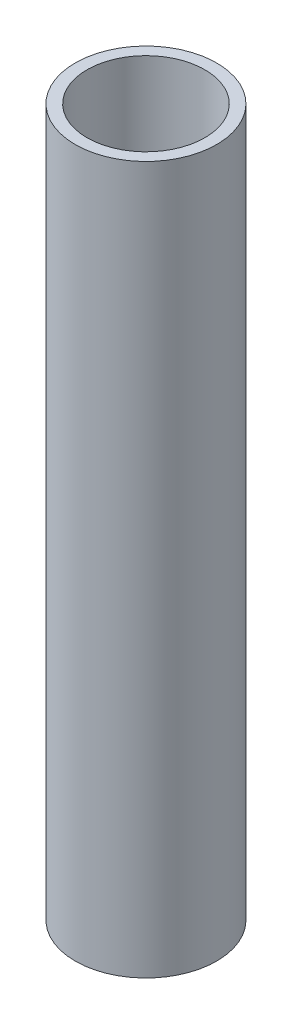
ISO-10303-21;
HEADER;
FILE_DESCRIPTION(('STEP AP214'),'2;1');
FILE_NAME('part.step','',(''),(''),'','','');
FILE_SCHEMA(('AUTOMOTIVE_DESIGN { 1 0 10303 214 1 1 1 1 }'));
ENDSEC;
DATA;
#1=APPLICATION_CONTEXT('core data for automotive mechanical design processes');
#2=APPLICATION_PROTOCOL_DEFINITION('international standard','automotive_design',2000,#1);
#3=PRODUCT_CONTEXT('',#1,'mechanical');
#4=PRODUCT('Part','Part','',(#3));
#5=PRODUCT_RELATED_PRODUCT_CATEGORY('part','',(#4));
#6=PRODUCT_DEFINITION_FORMATION('','',#4);
#7=PRODUCT_DEFINITION_CONTEXT('part definition',#1,'design');
#8=PRODUCT_DEFINITION('design','',#6,#7);
#9=PRODUCT_DEFINITION_SHAPE('','',#8);
#10=(LENGTH_UNIT() NAMED_UNIT(*) SI_UNIT(.MILLI.,.METRE.));
#11=(NAMED_UNIT(*) PLANE_ANGLE_UNIT() SI_UNIT($,.RADIAN.));
#12=(NAMED_UNIT(*) SI_UNIT($,.STERADIAN.) SOLID_ANGLE_UNIT());
#13=UNCERTAINTY_MEASURE_WITH_UNIT(LENGTH_MEASURE(1.E-05),#10,'distance_accuracy_value','');
#14=(GEOMETRIC_REPRESENTATION_CONTEXT(3) GLOBAL_UNCERTAINTY_ASSIGNED_CONTEXT((#13)) GLOBAL_UNIT_ASSIGNED_CONTEXT((#10,
#11,#12)) REPRESENTATION_CONTEXT('',''));
#15=CARTESIAN_POINT('',(0.,0.,0.));
#16=DIRECTION('',(0.,0.,1.));
#17=DIRECTION('',(1.,0.,0.));
#18=AXIS2_PLACEMENT_3D('',#15,#16,#17);
#19=CARTESIAN_POINT('',(0.,190.5,0.));
#20=DIRECTION('',(0.,1.,0.));
#21=DIRECTION('',(0.,0.,1.));
#22=AXIS2_PLACEMENT_3D('',#19,#20,#21);
#23=PLANE('',#22);
#24=CARTESIAN_POINT('',(0.,190.5,0.));
#25=DIRECTION('',(0.,1.,0.));
#26=DIRECTION('',(0.,0.,1.));
#27=AXIS2_PLACEMENT_3D('',#24,#25,#26);
#28=CIRCLE('',#27,19.05);
#29=CARTESIAN_POINT('',(0.,190.5,19.05));
#30=VERTEX_POINT('',#29);
#31=EDGE_CURVE('E10',#30,#30,#28,.T.);
#32=ORIENTED_EDGE('',*,*,#31,.T.);
#33=EDGE_LOOP('',(#32));
#34=FACE_BOUND('',#33,.T.);
#35=CARTESIAN_POINT('',(0.,190.5,0.));
#36=DIRECTION('',(0.,1.,0.));
#37=DIRECTION('',(0.,0.,1.));
#38=AXIS2_PLACEMENT_3D('',#35,#36,#37);
#39=CIRCLE('',#38,15.875);
#40=CARTESIAN_POINT('',(0.,190.5,15.875));
#41=VERTEX_POINT('',#40);
#42=EDGE_CURVE('E43',#41,#41,#39,.T.);
#43=ORIENTED_EDGE('',*,*,#42,.F.);
#44=EDGE_LOOP('',(#43));
#45=FACE_BOUND('',#44,.T.);
#46=ADVANCED_FACE('F32',(#34,#45),#23,.T.);
#47=CARTESIAN_POINT('',(0.,0.,0.));
#48=DIRECTION('',(0.,1.,0.));
#49=DIRECTION('',(0.,0.,1.));
#50=AXIS2_PLACEMENT_3D('',#47,#48,#49);
#51=PLANE('',#50);
#52=CARTESIAN_POINT('',(0.,0.,0.));
#53=DIRECTION('',(0.,1.,0.));
#54=DIRECTION('',(0.,0.,1.));
#55=AXIS2_PLACEMENT_3D('',#52,#53,#54);
#56=CIRCLE('',#55,19.05);
#57=CARTESIAN_POINT('',(0.,0.,19.05));
#58=VERTEX_POINT('',#57);
#59=EDGE_CURVE('E36',#58,#58,#56,.T.);
#60=ORIENTED_EDGE('',*,*,#59,.F.);
#61=EDGE_LOOP('',(#60));
#62=FACE_BOUND('',#61,.T.);
#63=CARTESIAN_POINT('',(0.,0.,0.));
#64=DIRECTION('',(0.,1.,0.));
#65=DIRECTION('',(0.,0.,1.));
#66=AXIS2_PLACEMENT_3D('',#63,#64,#65);
#67=CIRCLE('',#66,15.875);
#68=CARTESIAN_POINT('',(0.,0.,15.875));
#69=VERTEX_POINT('',#68);
#70=EDGE_CURVE('E45',#69,#69,#67,.T.);
#71=ORIENTED_EDGE('',*,*,#70,.T.);
#72=EDGE_LOOP('',(#71));
#73=FACE_BOUND('',#72,.T.);
#74=ADVANCED_FACE('F55',(#62,#73),#51,.F.);
#75=CARTESIAN_POINT('',(0.,190.5,0.));
#76=DIRECTION('',(0.,-1.,0.));
#77=DIRECTION('',(0.,0.,-1.));
#78=AXIS2_PLACEMENT_3D('',#75,#76,#77);
#79=CYLINDRICAL_SURFACE('',#78,19.05);
#80=ORIENTED_EDGE('',*,*,#31,.F.);
#81=EDGE_LOOP('',(#80));
#82=FACE_BOUND('',#81,.T.);
#83=ORIENTED_EDGE('',*,*,#59,.T.);
#84=EDGE_LOOP('',(#83));
#85=FACE_BOUND('',#84,.T.);
#86=ADVANCED_FACE('F34',(#82,#85),#79,.T.);
#87=CARTESIAN_POINT('',(0.,190.5,0.));
#88=DIRECTION('',(0.,-1.,0.));
#89=DIRECTION('',(0.,0.,-1.));
#90=AXIS2_PLACEMENT_3D('',#87,#88,#89);
#91=CYLINDRICAL_SURFACE('',#90,15.875);
#92=ORIENTED_EDGE('',*,*,#42,.T.);
#93=EDGE_LOOP('',(#92));
#94=FACE_BOUND('',#93,.T.);
#95=ORIENTED_EDGE('',*,*,#70,.F.);
#96=EDGE_LOOP('',(#95));
#97=FACE_BOUND('',#96,.T.);
#98=ADVANCED_FACE('F51',(#94,#97),#91,.F.);
#99=CLOSED_SHELL('',(#46,#74,#86,#98));
#100=MANIFOLD_SOLID_BREP('B2',#99);
#101=ADVANCED_BREP_SHAPE_REPRESENTATION('',(#18,#100),#14);
#102=SHAPE_DEFINITION_REPRESENTATION(#9,#101);
ENDSEC;
END-ISO-10303-21;
